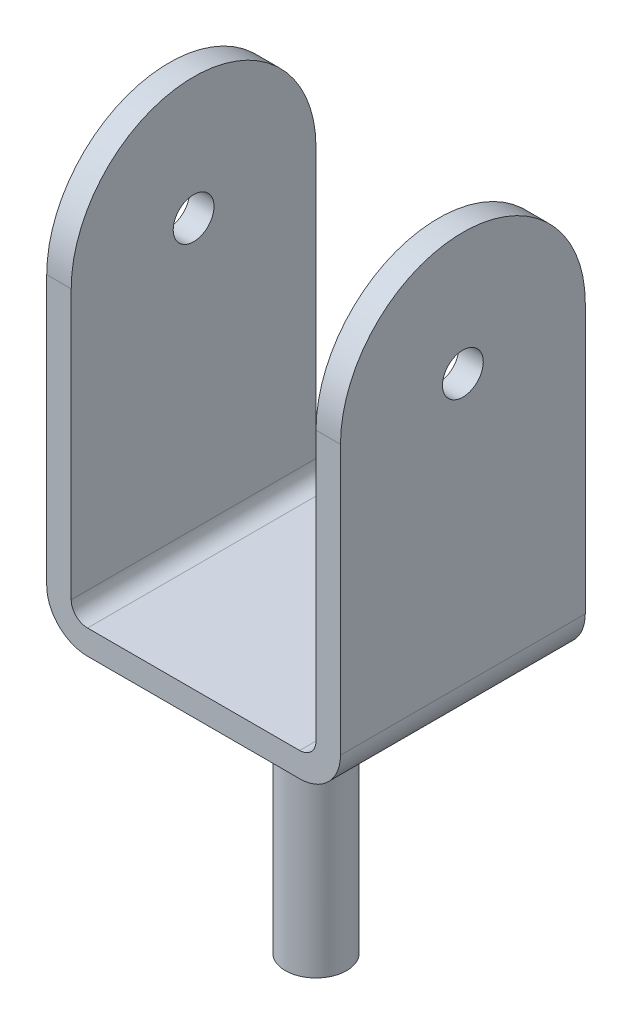
ISO-10303-21;
HEADER;
FILE_DESCRIPTION(('STEP AP214'),'2;1');
FILE_NAME('part.step','',(''),(''),'','','');
FILE_SCHEMA(('AUTOMOTIVE_DESIGN { 1 0 10303 214 1 1 1 1 }'));
ENDSEC;
DATA;
#1=APPLICATION_CONTEXT('core data for automotive mechanical design processes');
#2=APPLICATION_PROTOCOL_DEFINITION('international standard','automotive_design',2000,#1);
#3=PRODUCT_CONTEXT('',#1,'mechanical');
#4=PRODUCT('Part','Part','',(#3));
#5=PRODUCT_RELATED_PRODUCT_CATEGORY('part','',(#4));
#6=PRODUCT_DEFINITION_FORMATION('','',#4);
#7=PRODUCT_DEFINITION_CONTEXT('part definition',#1,'design');
#8=PRODUCT_DEFINITION('design','',#6,#7);
#9=PRODUCT_DEFINITION_SHAPE('','',#8);
#10=(LENGTH_UNIT() NAMED_UNIT(*) SI_UNIT(.MILLI.,.METRE.));
#11=(NAMED_UNIT(*) PLANE_ANGLE_UNIT() SI_UNIT($,.RADIAN.));
#12=(NAMED_UNIT(*) SI_UNIT($,.STERADIAN.) SOLID_ANGLE_UNIT());
#13=UNCERTAINTY_MEASURE_WITH_UNIT(LENGTH_MEASURE(1.E-05),#10,'distance_accuracy_value','');
#14=(GEOMETRIC_REPRESENTATION_CONTEXT(3) GLOBAL_UNCERTAINTY_ASSIGNED_CONTEXT((#13)) GLOBAL_UNIT_ASSIGNED_CONTEXT((#10,
#11,#12)) REPRESENTATION_CONTEXT('',''));
#15=CARTESIAN_POINT('',(0.,0.,0.));
#16=DIRECTION('',(0.,0.,1.));
#17=DIRECTION('',(1.,0.,0.));
#18=AXIS2_PLACEMENT_3D('',#15,#16,#17);
#19=CARTESIAN_POINT('',(-180.,380.,300.));
#20=DIRECTION('',(1.,0.,0.));
#21=DIRECTION('',(0.,1.,0.));
#22=AXIS2_PLACEMENT_3D('',#19,#20,#21);
#23=PLANE('',#22);
#24=CARTESIAN_POINT('',(-180.,380.,150.));
#25=DIRECTION('',(1.,0.,0.));
#26=DIRECTION('',(0.,1.,0.));
#27=AXIS2_PLACEMENT_3D('',#24,#25,#26);
#28=CIRCLE('',#27,25.);
#29=CARTESIAN_POINT('',(-180.,405.,150.));
#30=VERTEX_POINT('',#29);
#31=EDGE_CURVE('E258',#30,#30,#28,.F.);
#32=ORIENTED_EDGE('',*,*,#31,.F.);
#33=EDGE_LOOP('',(#32));
#34=FACE_BOUND('',#33,.T.);
#35=CARTESIAN_POINT('',(-180.,380.,150.));
#36=DIRECTION('',(-1.,0.,0.));
#37=DIRECTION('',(0.,1.,0.));
#38=AXIS2_PLACEMENT_3D('',#35,#36,#37);
#39=CIRCLE('',#38,150.);
#40=CARTESIAN_POINT('',(-180.,380.,300.));
#41=VERTEX_POINT('',#40);
#42=CARTESIAN_POINT('',(-180.,380.,0.));
#43=VERTEX_POINT('',#42);
#44=EDGE_CURVE('E253',#41,#43,#39,.T.);
#45=ORIENTED_EDGE('',*,*,#44,.T.);
#46=DIRECTION('',(0.,-1.,0.));
#47=VECTOR('',#46,1.);
#48=CARTESIAN_POINT('',(-180.,380.,0.));
#49=LINE('',#48,#47);
#50=CARTESIAN_POINT('',(-180.,50.,0.));
#51=VERTEX_POINT('',#50);
#52=EDGE_CURVE('E152',#43,#51,#49,.T.);
#53=ORIENTED_EDGE('',*,*,#52,.T.);
#54=DIRECTION('',(0.,0.,-1.));
#55=VECTOR('',#54,1.);
#56=CARTESIAN_POINT('',(-180.,50.,300.));
#57=LINE('',#56,#55);
#58=CARTESIAN_POINT('',(-180.,50.,300.));
#59=VERTEX_POINT('',#58);
#60=EDGE_CURVE('E48',#59,#51,#57,.T.);
#61=ORIENTED_EDGE('',*,*,#60,.F.);
#62=DIRECTION('',(0.,-1.,0.));
#63=VECTOR('',#62,1.);
#64=CARTESIAN_POINT('',(-180.,380.,300.));
#65=LINE('',#64,#63);
#66=EDGE_CURVE('E103',#41,#59,#65,.T.);
#67=ORIENTED_EDGE('',*,*,#66,.F.);
#68=EDGE_LOOP('',(#45,#53,#61,#67));
#69=FACE_BOUND('',#68,.T.);
#70=ADVANCED_FACE('F39',(#34,#69),#23,.F.);
#71=CARTESIAN_POINT('',(-130.,50.,300.));
#72=DIRECTION('',(0.,0.,-1.));
#73=DIRECTION('',(-1.,0.,0.));
#74=AXIS2_PLACEMENT_3D('',#71,#72,#73);
#75=CYLINDRICAL_SURFACE('',#74,50.);
#76=CARTESIAN_POINT('',(-130.,50.,0.));
#77=DIRECTION('',(0.,0.,1.));
#78=DIRECTION('',(-1.,0.,0.));
#79=AXIS2_PLACEMENT_3D('',#76,#77,#78);
#80=CIRCLE('',#79,50.);
#81=CARTESIAN_POINT('',(-130.,0.,0.));
#82=VERTEX_POINT('',#81);
#83=EDGE_CURVE('E155',#51,#82,#80,.T.);
#84=ORIENTED_EDGE('',*,*,#83,.T.);
#85=DIRECTION('',(0.,0.,-1.));
#86=VECTOR('',#85,1.);
#87=CARTESIAN_POINT('',(-130.,0.,300.));
#88=LINE('',#87,#86);
#89=CARTESIAN_POINT('',(-130.,0.,300.));
#90=VERTEX_POINT('',#89);
#91=EDGE_CURVE('E184',#90,#82,#88,.T.);
#92=ORIENTED_EDGE('',*,*,#91,.F.);
#93=CARTESIAN_POINT('',(-130.,50.,300.));
#94=DIRECTION('',(0.,0.,1.));
#95=DIRECTION('',(-1.,0.,0.));
#96=AXIS2_PLACEMENT_3D('',#93,#94,#95);
#97=CIRCLE('',#96,50.);
#98=EDGE_CURVE('E193',#59,#90,#97,.T.);
#99=ORIENTED_EDGE('',*,*,#98,.F.);
#100=ORIENTED_EDGE('',*,*,#60,.T.);
#101=EDGE_LOOP('',(#84,#92,#99,#100));
#102=FACE_BOUND('',#101,.T.);
#103=ADVANCED_FACE('F191',(#102),#75,.T.);
#104=CARTESIAN_POINT('',(-130.,0.,300.));
#105=DIRECTION('',(0.,1.,0.));
#106=DIRECTION('',(0.,0.,1.));
#107=AXIS2_PLACEMENT_3D('',#104,#105,#106);
#108=PLANE('',#107);
#109=CARTESIAN_POINT('',(0.,0.,150.));
#110=DIRECTION('',(0.,1.,0.));
#111=DIRECTION('',(0.,0.,1.));
#112=AXIS2_PLACEMENT_3D('',#109,#110,#111);
#113=CIRCLE('',#112,37.5);
#114=CARTESIAN_POINT('',(0.,0.,187.5));
#115=VERTEX_POINT('',#114);
#116=EDGE_CURVE('E11',#115,#115,#113,.F.);
#117=ORIENTED_EDGE('',*,*,#116,.F.);
#118=EDGE_LOOP('',(#117));
#119=FACE_BOUND('',#118,.T.);
#120=DIRECTION('',(1.,0.,0.));
#121=VECTOR('',#120,1.);
#122=CARTESIAN_POINT('',(-130.,0.,0.));
#123=LINE('',#122,#121);
#124=CARTESIAN_POINT('',(130.,0.,0.));
#125=VERTEX_POINT('',#124);
#126=EDGE_CURVE('E157',#82,#125,#123,.T.);
#127=ORIENTED_EDGE('',*,*,#126,.T.);
#128=DIRECTION('',(0.,0.,-1.));
#129=VECTOR('',#128,1.);
#130=CARTESIAN_POINT('',(130.,0.,300.));
#131=LINE('',#130,#129);
#132=CARTESIAN_POINT('',(130.,0.,300.));
#133=VERTEX_POINT('',#132);
#134=EDGE_CURVE('E181',#133,#125,#131,.T.);
#135=ORIENTED_EDGE('',*,*,#134,.F.);
#136=DIRECTION('',(1.,0.,0.));
#137=VECTOR('',#136,1.);
#138=CARTESIAN_POINT('',(-130.,0.,300.));
#139=LINE('',#138,#137);
#140=EDGE_CURVE('E215',#90,#133,#139,.T.);
#141=ORIENTED_EDGE('',*,*,#140,.F.);
#142=ORIENTED_EDGE('',*,*,#91,.T.);
#143=EDGE_LOOP('',(#127,#135,#141,#142));
#144=FACE_BOUND('',#143,.T.);
#145=ADVANCED_FACE('F205',(#119,#144),#108,.F.);
#146=CARTESIAN_POINT('',(130.,50.,300.));
#147=DIRECTION('',(0.,0.,-1.));
#148=DIRECTION('',(-1.,0.,0.));
#149=AXIS2_PLACEMENT_3D('',#146,#147,#148);
#150=CYLINDRICAL_SURFACE('',#149,50.);
#151=CARTESIAN_POINT('',(130.,50.,0.));
#152=DIRECTION('',(0.,0.,1.));
#153=DIRECTION('',(1.,0.,0.));
#154=AXIS2_PLACEMENT_3D('',#151,#152,#153);
#155=CIRCLE('',#154,50.);
#156=CARTESIAN_POINT('',(180.,50.0000000000004,0.));
#157=VERTEX_POINT('',#156);
#158=EDGE_CURVE('E159',#125,#157,#155,.T.);
#159=ORIENTED_EDGE('',*,*,#158,.T.);
#160=DIRECTION('',(0.,0.,-1.));
#161=VECTOR('',#160,1.);
#162=CARTESIAN_POINT('',(180.,50.0000000000004,300.));
#163=LINE('',#162,#161);
#164=CARTESIAN_POINT('',(180.,50.0000000000004,300.));
#165=VERTEX_POINT('',#164);
#166=EDGE_CURVE('E178',#165,#157,#163,.T.);
#167=ORIENTED_EDGE('',*,*,#166,.F.);
#168=CARTESIAN_POINT('',(130.,50.,300.));
#169=DIRECTION('',(0.,0.,1.));
#170=DIRECTION('',(1.,0.,0.));
#171=AXIS2_PLACEMENT_3D('',#168,#169,#170);
#172=CIRCLE('',#171,50.);
#173=EDGE_CURVE('E211',#133,#165,#172,.T.);
#174=ORIENTED_EDGE('',*,*,#173,.F.);
#175=ORIENTED_EDGE('',*,*,#134,.T.);
#176=EDGE_LOOP('',(#159,#167,#174,#175));
#177=FACE_BOUND('',#176,.T.);
#178=ADVANCED_FACE('F209',(#177),#150,.T.);
#179=CARTESIAN_POINT('',(180.,50.0000000000004,300.));
#180=DIRECTION('',(-1.,0.,0.));
#181=DIRECTION('',(0.,-1.,0.));
#182=AXIS2_PLACEMENT_3D('',#179,#180,#181);
#183=PLANE('',#182);
#184=CARTESIAN_POINT('',(180.,380.,150.));
#185=DIRECTION('',(1.,0.,0.));
#186=DIRECTION('',(0.,1.,0.));
#187=AXIS2_PLACEMENT_3D('',#184,#185,#186);
#188=CIRCLE('',#187,25.);
#189=CARTESIAN_POINT('',(180.,405.,150.));
#190=VERTEX_POINT('',#189);
#191=EDGE_CURVE('E255',#190,#190,#188,.T.);
#192=ORIENTED_EDGE('',*,*,#191,.F.);
#193=EDGE_LOOP('',(#192));
#194=FACE_BOUND('',#193,.T.);
#195=DIRECTION('',(0.,1.,0.));
#196=VECTOR('',#195,1.);
#197=CARTESIAN_POINT('',(180.,50.0000000000004,0.));
#198=LINE('',#197,#196);
#199=CARTESIAN_POINT('',(180.,380.,0.));
#200=VERTEX_POINT('',#199);
#201=EDGE_CURVE('E161',#157,#200,#198,.T.);
#202=ORIENTED_EDGE('',*,*,#201,.T.);
#203=CARTESIAN_POINT('',(180.,380.,150.));
#204=DIRECTION('',(1.,0.,0.));
#205=DIRECTION('',(0.,1.,0.));
#206=AXIS2_PLACEMENT_3D('',#203,#204,#205);
#207=CIRCLE('',#206,150.);
#208=CARTESIAN_POINT('',(180.,380.,300.));
#209=VERTEX_POINT('',#208);
#210=EDGE_CURVE('E263',#209,#200,#207,.F.);
#211=ORIENTED_EDGE('',*,*,#210,.F.);
#212=DIRECTION('',(0.,1.,0.));
#213=VECTOR('',#212,1.);
#214=CARTESIAN_POINT('',(180.,50.0000000000004,300.));
#215=LINE('',#214,#213);
#216=EDGE_CURVE('E214',#165,#209,#215,.T.);
#217=ORIENTED_EDGE('',*,*,#216,.F.);
#218=ORIENTED_EDGE('',*,*,#166,.T.);
#219=EDGE_LOOP('',(#202,#211,#217,#218));
#220=FACE_BOUND('',#219,.T.);
#221=ADVANCED_FACE('F288',(#194,#220),#183,.F.);
#222=CARTESIAN_POINT('',(150.,380.,300.));
#223=DIRECTION('',(1.,0.,0.));
#224=DIRECTION('',(0.,1.,0.));
#225=AXIS2_PLACEMENT_3D('',#222,#223,#224);
#226=PLANE('',#225);
#227=CARTESIAN_POINT('',(150.,380.,150.));
#228=DIRECTION('',(1.,0.,0.));
#229=DIRECTION('',(0.,1.,0.));
#230=AXIS2_PLACEMENT_3D('',#227,#228,#229);
#231=CIRCLE('',#230,150.);
#232=CARTESIAN_POINT('',(150.,380.,0.));
#233=VERTEX_POINT('',#232);
#234=CARTESIAN_POINT('',(150.,380.,300.));
#235=VERTEX_POINT('',#234);
#236=EDGE_CURVE('E231',#233,#235,#231,.T.);
#237=ORIENTED_EDGE('',*,*,#236,.F.);
#238=DIRECTION('',(0.,-1.,0.));
#239=VECTOR('',#238,1.);
#240=CARTESIAN_POINT('',(150.,380.,0.));
#241=LINE('',#240,#239);
#242=CARTESIAN_POINT('',(150.,50.,0.));
#243=VERTEX_POINT('',#242);
#244=EDGE_CURVE('E166',#233,#243,#241,.T.);
#245=ORIENTED_EDGE('',*,*,#244,.T.);
#246=DIRECTION('',(0.,0.,-1.));
#247=VECTOR('',#246,1.);
#248=CARTESIAN_POINT('',(150.,50.,300.));
#249=LINE('',#248,#247);
#250=CARTESIAN_POINT('',(150.,50.,300.));
#251=VERTEX_POINT('',#250);
#252=EDGE_CURVE('E138',#251,#243,#249,.T.);
#253=ORIENTED_EDGE('',*,*,#252,.F.);
#254=DIRECTION('',(0.,-1.,0.));
#255=VECTOR('',#254,1.);
#256=CARTESIAN_POINT('',(150.,380.,300.));
#257=LINE('',#256,#255);
#258=EDGE_CURVE('E129',#235,#251,#257,.T.);
#259=ORIENTED_EDGE('',*,*,#258,.F.);
#260=EDGE_LOOP('',(#237,#245,#253,#259));
#261=FACE_BOUND('',#260,.T.);
#262=CARTESIAN_POINT('',(150.,380.,150.));
#263=DIRECTION('',(1.,0.,0.));
#264=DIRECTION('',(0.,1.,0.));
#265=AXIS2_PLACEMENT_3D('',#262,#263,#264);
#266=CIRCLE('',#265,25.);
#267=CARTESIAN_POINT('',(150.,405.,150.));
#268=VERTEX_POINT('',#267);
#269=EDGE_CURVE('E262',#268,#268,#266,.F.);
#270=ORIENTED_EDGE('',*,*,#269,.F.);
#271=EDGE_LOOP('',(#270));
#272=FACE_BOUND('',#271,.T.);
#273=ADVANCED_FACE('F229',(#261,#272),#226,.F.);
#274=CARTESIAN_POINT('',(130.,50.,300.));
#275=DIRECTION('',(0.,0.,-1.));
#276=DIRECTION('',(-1.,0.,0.));
#277=AXIS2_PLACEMENT_3D('',#274,#275,#276);
#278=CYLINDRICAL_SURFACE('',#277,20.);
#279=CARTESIAN_POINT('',(130.,50.,0.));
#280=DIRECTION('',(0.,0.,-1.));
#281=DIRECTION('',(1.,0.,0.));
#282=AXIS2_PLACEMENT_3D('',#279,#280,#281);
#283=CIRCLE('',#282,20.);
#284=CARTESIAN_POINT('',(130.,30.,0.));
#285=VERTEX_POINT('',#284);
#286=EDGE_CURVE('E137',#243,#285,#283,.T.);
#287=ORIENTED_EDGE('',*,*,#286,.T.);
#288=DIRECTION('',(0.,0.,-1.));
#289=VECTOR('',#288,1.);
#290=CARTESIAN_POINT('',(130.,30.,300.));
#291=LINE('',#290,#289);
#292=CARTESIAN_POINT('',(130.,30.,300.));
#293=VERTEX_POINT('',#292);
#294=EDGE_CURVE('E134',#293,#285,#291,.T.);
#295=ORIENTED_EDGE('',*,*,#294,.F.);
#296=CARTESIAN_POINT('',(130.,50.,300.));
#297=DIRECTION('',(0.,0.,-1.));
#298=DIRECTION('',(1.,0.,0.));
#299=AXIS2_PLACEMENT_3D('',#296,#297,#298);
#300=CIRCLE('',#299,20.);
#301=EDGE_CURVE('E122',#251,#293,#300,.T.);
#302=ORIENTED_EDGE('',*,*,#301,.F.);
#303=ORIENTED_EDGE('',*,*,#252,.T.);
#304=EDGE_LOOP('',(#287,#295,#302,#303));
#305=FACE_BOUND('',#304,.T.);
#306=ADVANCED_FACE('F135',(#305),#278,.F.);
#307=CARTESIAN_POINT('',(130.,30.,300.));
#308=DIRECTION('',(0.,-1.,0.));
#309=DIRECTION('',(1.,0.,0.));
#310=AXIS2_PLACEMENT_3D('',#307,#308,#309);
#311=PLANE('',#310);
#312=DIRECTION('',(-1.,0.,0.));
#313=VECTOR('',#312,1.);
#314=CARTESIAN_POINT('',(130.,30.,0.));
#315=LINE('',#314,#313);
#316=CARTESIAN_POINT('',(-130.,30.,0.));
#317=VERTEX_POINT('',#316);
#318=EDGE_CURVE('E89',#285,#317,#315,.T.);
#319=ORIENTED_EDGE('',*,*,#318,.T.);
#320=DIRECTION('',(0.,0.,-1.));
#321=VECTOR('',#320,1.);
#322=CARTESIAN_POINT('',(-130.,30.,300.));
#323=LINE('',#322,#321);
#324=CARTESIAN_POINT('',(-130.,30.,300.));
#325=VERTEX_POINT('',#324);
#326=EDGE_CURVE('E139',#325,#317,#323,.T.);
#327=ORIENTED_EDGE('',*,*,#326,.F.);
#328=DIRECTION('',(-1.,0.,0.));
#329=VECTOR('',#328,1.);
#330=CARTESIAN_POINT('',(130.,30.,300.));
#331=LINE('',#330,#329);
#332=EDGE_CURVE('E126',#293,#325,#331,.T.);
#333=ORIENTED_EDGE('',*,*,#332,.F.);
#334=ORIENTED_EDGE('',*,*,#294,.T.);
#335=EDGE_LOOP('',(#319,#327,#333,#334));
#336=FACE_BOUND('',#335,.T.);
#337=ADVANCED_FACE('F141',(#336),#311,.F.);
#338=CARTESIAN_POINT('',(-130.,50.,300.));
#339=DIRECTION('',(0.,0.,-1.));
#340=DIRECTION('',(-1.,0.,0.));
#341=AXIS2_PLACEMENT_3D('',#338,#339,#340);
#342=CYLINDRICAL_SURFACE('',#341,20.);
#343=CARTESIAN_POINT('',(-130.,50.,0.));
#344=DIRECTION('',(0.,0.,-1.));
#345=DIRECTION('',(-1.,0.,0.));
#346=AXIS2_PLACEMENT_3D('',#343,#344,#345);
#347=CIRCLE('',#346,20.);
#348=CARTESIAN_POINT('',(-150.,50.0000000000001,0.));
#349=VERTEX_POINT('',#348);
#350=EDGE_CURVE('E95',#317,#349,#347,.T.);
#351=ORIENTED_EDGE('',*,*,#350,.T.);
#352=DIRECTION('',(0.,0.,-1.));
#353=VECTOR('',#352,1.);
#354=CARTESIAN_POINT('',(-150.,50.0000000000001,300.));
#355=LINE('',#354,#353);
#356=CARTESIAN_POINT('',(-150.,50.0000000000001,300.));
#357=VERTEX_POINT('',#356);
#358=EDGE_CURVE('E148',#357,#349,#355,.T.);
#359=ORIENTED_EDGE('',*,*,#358,.F.);
#360=CARTESIAN_POINT('',(-130.,50.,300.));
#361=DIRECTION('',(0.,0.,-1.));
#362=DIRECTION('',(-1.,0.,0.));
#363=AXIS2_PLACEMENT_3D('',#360,#361,#362);
#364=CIRCLE('',#363,20.);
#365=EDGE_CURVE('E56',#325,#357,#364,.T.);
#366=ORIENTED_EDGE('',*,*,#365,.F.);
#367=ORIENTED_EDGE('',*,*,#326,.T.);
#368=EDGE_LOOP('',(#351,#359,#366,#367));
#369=FACE_BOUND('',#368,.T.);
#370=ADVANCED_FACE('F304',(#369),#342,.F.);
#371=CARTESIAN_POINT('',(-150.,50.0000000000001,300.));
#372=DIRECTION('',(-1.,0.,0.));
#373=DIRECTION('',(0.,-1.,0.));
#374=AXIS2_PLACEMENT_3D('',#371,#372,#373);
#375=PLANE('',#374);
#376=CARTESIAN_POINT('',(-150.,380.,150.));
#377=DIRECTION('',(-1.,0.,0.));
#378=DIRECTION('',(0.,-1.,0.));
#379=AXIS2_PLACEMENT_3D('',#376,#377,#378);
#380=CIRCLE('',#379,25.);
#381=CARTESIAN_POINT('',(-150.,355.,150.));
#382=VERTEX_POINT('',#381);
#383=EDGE_CURVE('E42',#382,#382,#380,.T.);
#384=ORIENTED_EDGE('',*,*,#383,.T.);
#385=EDGE_LOOP('',(#384));
#386=FACE_BOUND('',#385,.T.);
#387=DIRECTION('',(0.,1.,0.));
#388=VECTOR('',#387,1.);
#389=CARTESIAN_POINT('',(-150.,50.0000000000001,0.));
#390=LINE('',#389,#388);
#391=CARTESIAN_POINT('',(-150.,380.,0.));
#392=VERTEX_POINT('',#391);
#393=EDGE_CURVE('E171',#349,#392,#390,.T.);
#394=ORIENTED_EDGE('',*,*,#393,.T.);
#395=CARTESIAN_POINT('',(-150.,380.,150.));
#396=DIRECTION('',(-1.,0.,0.));
#397=DIRECTION('',(0.,-1.,0.));
#398=AXIS2_PLACEMENT_3D('',#395,#396,#397);
#399=CIRCLE('',#398,150.);
#400=CARTESIAN_POINT('',(-150.,380.,300.));
#401=VERTEX_POINT('',#400);
#402=EDGE_CURVE('E242',#392,#401,#399,.F.);
#403=ORIENTED_EDGE('',*,*,#402,.T.);
#404=DIRECTION('',(0.,1.,0.));
#405=VECTOR('',#404,1.);
#406=CARTESIAN_POINT('',(-150.,50.0000000000001,300.));
#407=LINE('',#406,#405);
#408=EDGE_CURVE('E143',#357,#401,#407,.T.);
#409=ORIENTED_EDGE('',*,*,#408,.F.);
#410=ORIENTED_EDGE('',*,*,#358,.T.);
#411=EDGE_LOOP('',(#394,#403,#409,#410));
#412=FACE_BOUND('',#411,.T.);
#413=ADVANCED_FACE('F238',(#386,#412),#375,.F.);
#414=CARTESIAN_POINT('',(-130.,50.,300.));
#415=DIRECTION('',(0.,0.,-1.));
#416=DIRECTION('',(-1.,0.,0.));
#417=AXIS2_PLACEMENT_3D('',#414,#415,#416);
#418=PLANE('',#417);
#419=ORIENTED_EDGE('',*,*,#365,.T.);
#420=ORIENTED_EDGE('',*,*,#408,.T.);
#421=DIRECTION('',(-1.,0.,0.));
#422=VECTOR('',#421,1.);
#423=CARTESIAN_POINT('',(-150.,380.,300.));
#424=LINE('',#423,#422);
#425=EDGE_CURVE('E174',#401,#41,#424,.T.);
#426=ORIENTED_EDGE('',*,*,#425,.T.);
#427=ORIENTED_EDGE('',*,*,#66,.T.);
#428=ORIENTED_EDGE('',*,*,#98,.T.);
#429=ORIENTED_EDGE('',*,*,#140,.T.);
#430=ORIENTED_EDGE('',*,*,#173,.T.);
#431=ORIENTED_EDGE('',*,*,#216,.T.);
#432=DIRECTION('',(-1.,0.,0.));
#433=VECTOR('',#432,1.);
#434=CARTESIAN_POINT('',(180.,380.,300.));
#435=LINE('',#434,#433);
#436=EDGE_CURVE('E217',#209,#235,#435,.T.);
#437=ORIENTED_EDGE('',*,*,#436,.T.);
#438=ORIENTED_EDGE('',*,*,#258,.T.);
#439=ORIENTED_EDGE('',*,*,#301,.T.);
#440=ORIENTED_EDGE('',*,*,#332,.T.);
#441=EDGE_LOOP('',(#419,#420,#426,#427,#428,#429,#430,#431,#437,#438,#439,#440));
#442=FACE_BOUND('',#441,.T.);
#443=ADVANCED_FACE('F124',(#442),#418,.F.);
#444=CARTESIAN_POINT('',(-130.,50.,0.));
#445=DIRECTION('',(0.,0.,-1.));
#446=DIRECTION('',(-1.,0.,0.));
#447=AXIS2_PLACEMENT_3D('',#444,#445,#446);
#448=PLANE('',#447);
#449=ORIENTED_EDGE('',*,*,#83,.F.);
#450=ORIENTED_EDGE('',*,*,#52,.F.);
#451=DIRECTION('',(-1.,0.,0.));
#452=VECTOR('',#451,1.);
#453=CARTESIAN_POINT('',(-150.,380.,0.));
#454=LINE('',#453,#452);
#455=EDGE_CURVE('E149',#392,#43,#454,.T.);
#456=ORIENTED_EDGE('',*,*,#455,.F.);
#457=ORIENTED_EDGE('',*,*,#393,.F.);
#458=ORIENTED_EDGE('',*,*,#350,.F.);
#459=ORIENTED_EDGE('',*,*,#318,.F.);
#460=ORIENTED_EDGE('',*,*,#286,.F.);
#461=ORIENTED_EDGE('',*,*,#244,.F.);
#462=DIRECTION('',(-1.,0.,0.));
#463=VECTOR('',#462,1.);
#464=CARTESIAN_POINT('',(180.,380.,0.));
#465=LINE('',#464,#463);
#466=EDGE_CURVE('E163',#200,#233,#465,.T.);
#467=ORIENTED_EDGE('',*,*,#466,.F.);
#468=ORIENTED_EDGE('',*,*,#201,.F.);
#469=ORIENTED_EDGE('',*,*,#158,.F.);
#470=ORIENTED_EDGE('',*,*,#126,.F.);
#471=EDGE_LOOP('',(#449,#450,#456,#457,#458,#459,#460,#461,#467,#468,#469,#470));
#472=FACE_BOUND('',#471,.T.);
#473=ADVANCED_FACE('F198',(#472),#448,.T.);
#474=CARTESIAN_POINT('',(0.,-325.,150.));
#475=DIRECTION('',(0.,1.,0.));
#476=DIRECTION('',(0.,0.,1.));
#477=AXIS2_PLACEMENT_3D('',#474,#475,#476);
#478=CYLINDRICAL_SURFACE('',#477,37.5);
#479=CARTESIAN_POINT('',(0.,-325.,150.));
#480=DIRECTION('',(0.,-1.,0.));
#481=DIRECTION('',(0.,0.,-1.));
#482=AXIS2_PLACEMENT_3D('',#479,#480,#481);
#483=CIRCLE('',#482,37.5);
#484=CARTESIAN_POINT('',(0.,-325.,112.5));
#485=VERTEX_POINT('',#484);
#486=EDGE_CURVE('E153',#485,#485,#483,.T.);
#487=ORIENTED_EDGE('',*,*,#486,.F.);
#488=EDGE_LOOP('',(#487));
#489=FACE_BOUND('',#488,.T.);
#490=ORIENTED_EDGE('',*,*,#116,.T.);
#491=EDGE_LOOP('',(#490));
#492=FACE_BOUND('',#491,.T.);
#493=ADVANCED_FACE('F276',(#489,#492),#478,.T.);
#494=CARTESIAN_POINT('',(0.,-325.,150.));
#495=DIRECTION('',(0.,-1.,0.));
#496=DIRECTION('',(0.,0.,-1.));
#497=AXIS2_PLACEMENT_3D('',#494,#495,#496);
#498=PLANE('',#497);
#499=ORIENTED_EDGE('',*,*,#486,.T.);
#500=EDGE_LOOP('',(#499));
#501=FACE_BOUND('',#500,.T.);
#502=ADVANCED_FACE('F274',(#501),#498,.T.);
#503=CARTESIAN_POINT('',(-185.410196624969,380.,150.));
#504=DIRECTION('',(1.,0.,0.));
#505=DIRECTION('',(0.,1.,0.));
#506=AXIS2_PLACEMENT_3D('',#503,#504,#505);
#507=CYLINDRICAL_SURFACE('',#506,150.);
#508=ORIENTED_EDGE('',*,*,#466,.T.);
#509=ORIENTED_EDGE('',*,*,#236,.T.);
#510=ORIENTED_EDGE('',*,*,#436,.F.);
#511=ORIENTED_EDGE('',*,*,#210,.T.);
#512=EDGE_LOOP('',(#508,#509,#510,#511));
#513=FACE_BOUND('',#512,.T.);
#514=ADVANCED_FACE('F326',(#513),#507,.T.);
#515=CARTESIAN_POINT('',(-185.410196624969,380.,150.));
#516=DIRECTION('',(1.,0.,0.));
#517=DIRECTION('',(0.,1.,0.));
#518=AXIS2_PLACEMENT_3D('',#515,#516,#517);
#519=CYLINDRICAL_SURFACE('',#518,25.);
#520=CARTESIAN_POINT('',(180.,405.,150.));
#521=CARTESIAN_POINT('',(179.6875,405.,150.));
#522=CARTESIAN_POINT('',(179.375,405.,150.));
#523=CARTESIAN_POINT('',(178.75,405.,150.));
#524=CARTESIAN_POINT('',(178.4375,405.,150.));
#525=CARTESIAN_POINT('',(177.8125,405.,150.));
#526=CARTESIAN_POINT('',(177.5,405.,150.));
#527=CARTESIAN_POINT('',(176.875,405.,150.));
#528=CARTESIAN_POINT('',(176.5625,405.,150.));
#529=CARTESIAN_POINT('',(175.9375,405.,150.));
#530=CARTESIAN_POINT('',(175.625,405.,150.));
#531=CARTESIAN_POINT('',(175.,405.,150.));
#532=CARTESIAN_POINT('',(174.6875,405.,150.));
#533=CARTESIAN_POINT('',(174.0625,405.,150.));
#534=CARTESIAN_POINT('',(173.75,405.,150.));
#535=CARTESIAN_POINT('',(173.125,405.,150.));
#536=CARTESIAN_POINT('',(172.8125,405.,150.));
#537=CARTESIAN_POINT('',(172.1875,405.,150.));
#538=CARTESIAN_POINT('',(171.875,405.,150.));
#539=CARTESIAN_POINT('',(171.25,405.,150.));
#540=CARTESIAN_POINT('',(170.9375,405.,150.));
#541=CARTESIAN_POINT('',(170.3125,405.,150.));
#542=CARTESIAN_POINT('',(170.,405.,150.));
#543=CARTESIAN_POINT('',(169.375,405.,150.));
#544=CARTESIAN_POINT('',(169.0625,405.,150.));
#545=CARTESIAN_POINT('',(168.4375,405.,150.));
#546=CARTESIAN_POINT('',(168.125,405.,150.));
#547=CARTESIAN_POINT('',(167.5,405.,150.));
#548=CARTESIAN_POINT('',(167.1875,405.,150.));
#549=CARTESIAN_POINT('',(166.5625,405.,150.));
#550=CARTESIAN_POINT('',(166.25,405.,150.));
#551=CARTESIAN_POINT('',(165.625,405.,150.));
#552=CARTESIAN_POINT('',(165.3125,405.,150.));
#553=CARTESIAN_POINT('',(164.6875,405.,150.));
#554=CARTESIAN_POINT('',(164.375,405.,150.));
#555=CARTESIAN_POINT('',(163.75,405.,150.));
#556=CARTESIAN_POINT('',(163.4375,405.,150.));
#557=CARTESIAN_POINT('',(162.8125,405.,150.));
#558=CARTESIAN_POINT('',(162.5,405.,150.));
#559=CARTESIAN_POINT('',(161.875,405.,150.));
#560=CARTESIAN_POINT('',(161.5625,405.,150.));
#561=CARTESIAN_POINT('',(160.9375,405.,150.));
#562=CARTESIAN_POINT('',(160.625,405.,150.));
#563=CARTESIAN_POINT('',(160.,405.,150.));
#564=CARTESIAN_POINT('',(159.6875,405.,150.));
#565=CARTESIAN_POINT('',(159.0625,405.,150.));
#566=CARTESIAN_POINT('',(158.75,405.,150.));
#567=CARTESIAN_POINT('',(158.125,405.,150.));
#568=CARTESIAN_POINT('',(157.8125,405.,150.));
#569=CARTESIAN_POINT('',(157.1875,405.,150.));
#570=CARTESIAN_POINT('',(156.875,405.,150.));
#571=CARTESIAN_POINT('',(156.25,405.,150.));
#572=CARTESIAN_POINT('',(155.9375,405.,150.));
#573=CARTESIAN_POINT('',(155.3125,405.,150.));
#574=CARTESIAN_POINT('',(155.,405.,150.));
#575=CARTESIAN_POINT('',(154.375,405.,150.));
#576=CARTESIAN_POINT('',(154.0625,405.,150.));
#577=CARTESIAN_POINT('',(153.4375,405.,150.));
#578=CARTESIAN_POINT('',(153.125,405.,150.));
#579=CARTESIAN_POINT('',(152.5,405.,150.));
#580=CARTESIAN_POINT('',(152.1875,405.,150.));
#581=CARTESIAN_POINT('',(151.5625,405.,150.));
#582=CARTESIAN_POINT('',(151.25,405.,150.));
#583=CARTESIAN_POINT('',(150.625,405.,150.));
#584=CARTESIAN_POINT('',(150.3125,405.,150.));
#585=CARTESIAN_POINT('',(150.,405.,150.));
#586=B_SPLINE_CURVE_WITH_KNOTS('',3,(#520,#521,#522,#523,#524,#525,#526,#527,#528,#529,#530,
#531,#532,#533,#534,#535,#536,#537,#538,#539,#540,#541,#542,#543,#544,#545,#546,#547,#548,#549,
#550,#551,#552,#553,#554,#555,#556,#557,#558,#559,#560,#561,#562,#563,#564,#565,#566,#567,#568,
#569,#570,#571,#572,#573,#574,#575,#576,#577,#578,#579,#580,#581,#582,#583,#584,#585),
.UNSPECIFIED.,.F.,.F.,(4,2,2,2,2,2,2,2,2,2,2,2,2,2,2,2,2,2,2,2,2,2,2,2,2,2,2,2,2,2,2,2,4),(0.,
0.93749999999998,1.87500000000002,2.8125,3.75000000000003,4.68750000000001,5.62499999999999,
6.56250000000003,7.50000000000001,8.43749999999999,9.37500000000002,10.3125,11.25,12.1875,
13.125,14.0625,15.,15.9375,16.875,17.8125,18.75,19.6875,20.625,21.5625,22.5,23.4375,24.375,
25.3125,26.25,27.1875,28.125,29.0625,30.),.UNSPECIFIED.);
#587=EDGE_CURVE('BSEAM328',#190,#268,#586,.T.);
#588=ORIENTED_EDGE('',*,*,#191,.T.);
#589=ORIENTED_EDGE('',*,*,#269,.T.);
#590=ORIENTED_EDGE('',*,*,#587,.T.);
#591=ORIENTED_EDGE('',*,*,#587,.F.);
#592=EDGE_LOOP('',(#588,#590,#589,#591));
#593=FACE_BOUND('',#592,.T.);
#594=ADVANCED_FACE('F328',(#593),#519,.F.);
#595=CARTESIAN_POINT('',(416.038867923396,380.,150.));
#596=DIRECTION('',(-1.,0.,0.));
#597=DIRECTION('',(0.,-1.,0.));
#598=AXIS2_PLACEMENT_3D('',#595,#596,#597);
#599=CYLINDRICAL_SURFACE('',#598,150.);
#600=ORIENTED_EDGE('',*,*,#402,.F.);
#601=ORIENTED_EDGE('',*,*,#455,.T.);
#602=ORIENTED_EDGE('',*,*,#44,.F.);
#603=ORIENTED_EDGE('',*,*,#425,.F.);
#604=EDGE_LOOP('',(#600,#601,#602,#603));
#605=FACE_BOUND('',#604,.T.);
#606=ADVANCED_FACE('F252',(#605),#599,.T.);
#607=CARTESIAN_POINT('',(-250.710678118655,380.,150.));
#608=DIRECTION('',(1.,0.,0.));
#609=DIRECTION('',(0.,1.,0.));
#610=AXIS2_PLACEMENT_3D('',#607,#608,#609);
#611=CYLINDRICAL_SURFACE('',#610,25.);
#612=ORIENTED_EDGE('',*,*,#31,.T.);
#613=EDGE_LOOP('',(#612));
#614=FACE_BOUND('',#613,.T.);
#615=ORIENTED_EDGE('',*,*,#383,.F.);
#616=EDGE_LOOP('',(#615));
#617=FACE_BOUND('',#616,.T.);
#618=ADVANCED_FACE('F297',(#614,#617),#611,.F.);
#619=CLOSED_SHELL('',(#70,#103,#145,#178,#221,#273,#306,#337,#370,#413,#443,#473,#493,#502,#514,
#594,#606,#618));
#620=MANIFOLD_SOLID_BREP('B2',#619);
#621=ADVANCED_BREP_SHAPE_REPRESENTATION('',(#18,#620),#14);
#622=SHAPE_DEFINITION_REPRESENTATION(#9,#621);
ENDSEC;
END-ISO-10303-21;
